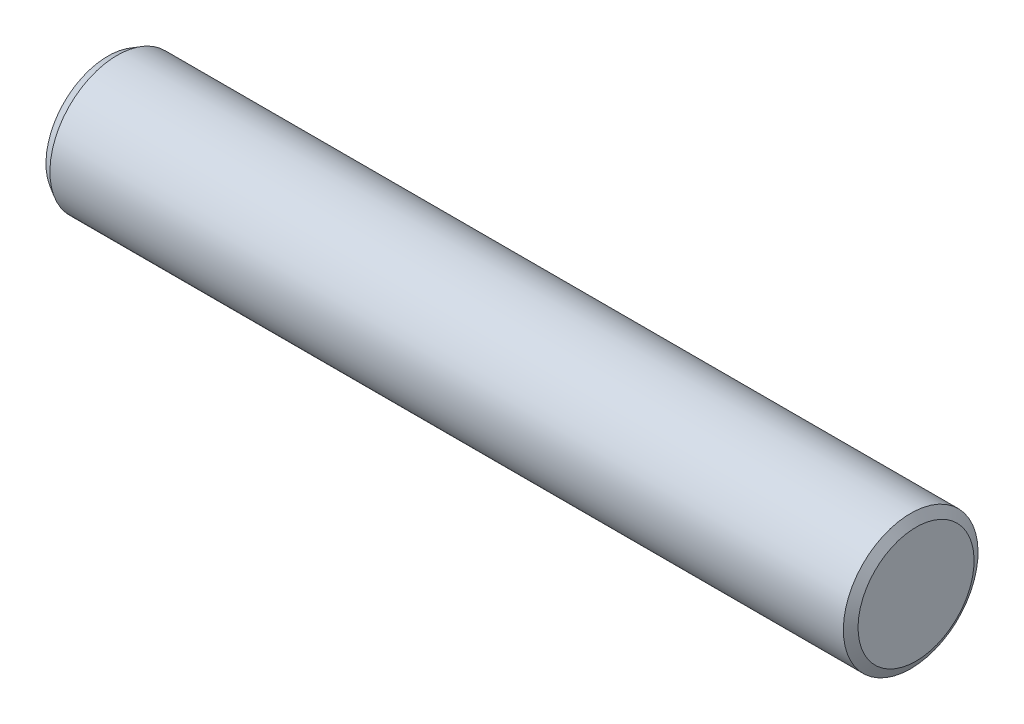
ISO-10303-21;
HEADER;
FILE_DESCRIPTION(('STEP AP214'),'2;1');
FILE_NAME('part.step','',(''),(''),'','','');
FILE_SCHEMA(('AUTOMOTIVE_DESIGN { 1 0 10303 214 1 1 1 1 }'));
ENDSEC;
DATA;
#1=APPLICATION_CONTEXT('core data for automotive mechanical design processes');
#2=APPLICATION_PROTOCOL_DEFINITION('international standard','automotive_design',2000,#1);
#3=PRODUCT_CONTEXT('',#1,'mechanical');
#4=PRODUCT('Part','Part','',(#3));
#5=PRODUCT_RELATED_PRODUCT_CATEGORY('part','',(#4));
#6=PRODUCT_DEFINITION_FORMATION('','',#4);
#7=PRODUCT_DEFINITION_CONTEXT('part definition',#1,'design');
#8=PRODUCT_DEFINITION('design','',#6,#7);
#9=PRODUCT_DEFINITION_SHAPE('','',#8);
#10=(LENGTH_UNIT() NAMED_UNIT(*) SI_UNIT(.MILLI.,.METRE.));
#11=(NAMED_UNIT(*) PLANE_ANGLE_UNIT() SI_UNIT($,.RADIAN.));
#12=(NAMED_UNIT(*) SI_UNIT($,.STERADIAN.) SOLID_ANGLE_UNIT());
#13=UNCERTAINTY_MEASURE_WITH_UNIT(LENGTH_MEASURE(1.E-05),#10,'distance_accuracy_value','');
#14=(GEOMETRIC_REPRESENTATION_CONTEXT(3) GLOBAL_UNCERTAINTY_ASSIGNED_CONTEXT((#13)) GLOBAL_UNIT_ASSIGNED_CONTEXT((#10,
#11,#12)) REPRESENTATION_CONTEXT('',''));
#15=CARTESIAN_POINT('',(0.,0.,0.));
#16=DIRECTION('',(0.,0.,1.));
#17=DIRECTION('',(1.,0.,0.));
#18=AXIS2_PLACEMENT_3D('',#15,#16,#17);
#19=CARTESIAN_POINT('',(0.,0.,0.));
#20=DIRECTION('',(1.,0.,0.));
#21=DIRECTION('',(0.,1.,0.));
#22=AXIS2_PLACEMENT_3D('',#19,#20,#21);
#23=PLANE('',#22);
#24=CARTESIAN_POINT('',(0.,0.,0.));
#25=DIRECTION('',(1.,0.,0.));
#26=DIRECTION('',(0.,1.,0.));
#27=AXIS2_PLACEMENT_3D('',#24,#25,#26);
#28=CIRCLE('',#27,2.15358983848623);
#29=CARTESIAN_POINT('',(0.,-2.15358983848623,0.));
#30=VERTEX_POINT('',#29);
#31=EDGE_CURVE('E10',#30,#30,#28,.T.);
#32=ORIENTED_EDGE('',*,*,#31,.T.);
#33=EDGE_LOOP('',(#32));
#34=FACE_BOUND('',#33,.T.);
#35=ADVANCED_FACE('F40',(#34),#23,.T.);
#36=CARTESIAN_POINT('',(0.,0.,0.));
#37=DIRECTION('',(1.,0.,0.));
#38=DIRECTION('',(0.,1.,0.));
#39=AXIS2_PLACEMENT_3D('',#36,#37,#38);
#40=CYLINDRICAL_SURFACE('',#39,2.5);
#41=CARTESIAN_POINT('',(-29.6535898384862,0.,0.));
#42=DIRECTION('',(-1.,0.,0.));
#43=DIRECTION('',(0.,-1.,0.));
#44=AXIS2_PLACEMENT_3D('',#41,#42,#43);
#45=CIRCLE('',#44,2.5);
#46=CARTESIAN_POINT('',(-29.6535898384862,-2.5,0.));
#47=VERTEX_POINT('',#46);
#48=EDGE_CURVE('E52',#47,#47,#45,.F.);
#49=ORIENTED_EDGE('',*,*,#48,.T.);
#50=EDGE_LOOP('',(#49));
#51=FACE_BOUND('',#50,.T.);
#52=CARTESIAN_POINT('',(-0.199999999999998,0.,0.));
#53=DIRECTION('',(1.,0.,0.));
#54=DIRECTION('',(0.,1.,0.));
#55=AXIS2_PLACEMENT_3D('',#52,#53,#54);
#56=CIRCLE('',#55,2.5);
#57=CARTESIAN_POINT('',(-0.199999999999997,-2.5,0.));
#58=VERTEX_POINT('',#57);
#59=EDGE_CURVE('E56',#58,#58,#56,.F.);
#60=ORIENTED_EDGE('',*,*,#59,.T.);
#61=EDGE_LOOP('',(#60));
#62=FACE_BOUND('',#61,.T.);
#63=ADVANCED_FACE('F62',(#51,#62),#40,.T.);
#64=CARTESIAN_POINT('',(-30.,0.,0.));
#65=DIRECTION('',(-1.,0.,0.));
#66=DIRECTION('',(0.,-1.,0.));
#67=AXIS2_PLACEMENT_3D('',#64,#65,#66);
#68=PLANE('',#67);
#69=CARTESIAN_POINT('',(-30.,0.,0.));
#70=DIRECTION('',(-1.,0.,0.));
#71=DIRECTION('',(0.,-1.,0.));
#72=AXIS2_PLACEMENT_3D('',#69,#70,#71);
#73=CIRCLE('',#72,2.29999999999998);
#74=CARTESIAN_POINT('',(-30.,-2.29999999999999,0.));
#75=VERTEX_POINT('',#74);
#76=EDGE_CURVE('E48',#75,#75,#73,.T.);
#77=ORIENTED_EDGE('',*,*,#76,.T.);
#78=EDGE_LOOP('',(#77));
#79=FACE_BOUND('',#78,.T.);
#80=ADVANCED_FACE('F70',(#79),#68,.T.);
#81=CARTESIAN_POINT('',(-29.6535898384862,0.,0.));
#82=DIRECTION('',(1.,0.,0.));
#83=DIRECTION('',(0.,1.,0.));
#84=AXIS2_PLACEMENT_3D('',#81,#82,#83);
#85=CONICAL_SURFACE('',#84,2.5,0.523598775598296);
#86=ORIENTED_EDGE('',*,*,#76,.F.);
#87=EDGE_LOOP('',(#86));
#88=FACE_BOUND('',#87,.T.);
#89=ORIENTED_EDGE('',*,*,#48,.F.);
#90=EDGE_LOOP('',(#89));
#91=FACE_BOUND('',#90,.T.);
#92=ADVANCED_FACE('F66',(#88,#91),#85,.T.);
#93=CARTESIAN_POINT('',(0.,0.,0.));
#94=DIRECTION('',(-1.,0.,0.));
#95=DIRECTION('',(0.,-1.,0.));
#96=AXIS2_PLACEMENT_3D('',#93,#94,#95);
#97=CONICAL_SURFACE('',#96,2.15358983848623,1.04719755119659);
#98=CARTESIAN_POINT('',(-0.199999999999997,-2.5,0.));
#99=CARTESIAN_POINT('',(-0.197916666666664,-2.49639156081756,0.));
#100=CARTESIAN_POINT('',(-0.195833333333331,-2.49278312163513,0.));
#101=CARTESIAN_POINT('',(-0.191666666666664,-2.48556624327026,0.));
#102=CARTESIAN_POINT('',(-0.189583333333331,-2.48195780408782,0.));
#103=CARTESIAN_POINT('',(-0.185416666666664,-2.47474092572295,0.));
#104=CARTESIAN_POINT('',(-0.183333333333331,-2.47113248654052,0.));
#105=CARTESIAN_POINT('',(-0.179166666666664,-2.46391560817565,0.));
#106=CARTESIAN_POINT('',(-0.177083333333331,-2.46030716899321,0.));
#107=CARTESIAN_POINT('',(-0.172916666666664,-2.45309029062834,0.));
#108=CARTESIAN_POINT('',(-0.170833333333331,-2.44948185144591,0.));
#109=CARTESIAN_POINT('',(-0.166666666666664,-2.44226497308104,0.));
#110=CARTESIAN_POINT('',(-0.164583333333331,-2.4386565338986,0.));
#111=CARTESIAN_POINT('',(-0.160416666666664,-2.43143965553373,0.));
#112=CARTESIAN_POINT('',(-0.158333333333331,-2.4278312163513,0.));
#113=CARTESIAN_POINT('',(-0.154166666666664,-2.42061433798643,0.));
#114=CARTESIAN_POINT('',(-0.152083333333331,-2.41700589880399,0.));
#115=CARTESIAN_POINT('',(-0.147916666666665,-2.40978902043912,0.));
#116=CARTESIAN_POINT('',(-0.145833333333331,-2.40618058125669,0.));
#117=CARTESIAN_POINT('',(-0.141666666666665,-2.39896370289182,0.));
#118=CARTESIAN_POINT('',(-0.139583333333331,-2.39535526370938,0.));
#119=CARTESIAN_POINT('',(-0.135416666666665,-2.38813838534451,0.));
#120=CARTESIAN_POINT('',(-0.133333333333331,-2.38452994616208,0.));
#121=CARTESIAN_POINT('',(-0.129166666666665,-2.37731306779721,0.));
#122=CARTESIAN_POINT('',(-0.127083333333331,-2.37370462861477,0.));
#123=CARTESIAN_POINT('',(-0.122916666666665,-2.3664877502499,0.));
#124=CARTESIAN_POINT('',(-0.120833333333332,-2.36287931106747,0.));
#125=CARTESIAN_POINT('',(-0.116666666666665,-2.3556624327026,0.));
#126=CARTESIAN_POINT('',(-0.114583333333332,-2.35205399352016,0.));
#127=CARTESIAN_POINT('',(-0.110416666666665,-2.34483711515529,0.));
#128=CARTESIAN_POINT('',(-0.108333333333332,-2.34122867597286,0.));
#129=CARTESIAN_POINT('',(-0.104166666666665,-2.33401179760799,0.));
#130=CARTESIAN_POINT('',(-0.102083333333332,-2.33040335842555,0.));
#131=CARTESIAN_POINT('',(-0.0979166666666651,-2.32318648006068,0.));
#132=CARTESIAN_POINT('',(-0.0958333333333318,-2.31957804087825,0.));
#133=CARTESIAN_POINT('',(-0.0916666666666652,-2.31236116251338,0.));
#134=CARTESIAN_POINT('',(-0.0895833333333319,-2.30875272333094,0.));
#135=CARTESIAN_POINT('',(-0.0854166666666653,-2.30153584496607,0.));
#136=CARTESIAN_POINT('',(-0.083333333333332,-2.29792740578364,0.));
#137=CARTESIAN_POINT('',(-0.0791666666666653,-2.29071052741876,0.));
#138=CARTESIAN_POINT('',(-0.077083333333332,-2.28710208823633,0.));
#139=CARTESIAN_POINT('',(-0.0729166666666654,-2.27988520987146,0.));
#140=CARTESIAN_POINT('',(-0.0708333333333321,-2.27627677068902,0.));
#141=CARTESIAN_POINT('',(-0.0666666666666655,-2.26905989232415,0.));
#142=CARTESIAN_POINT('',(-0.0645833333333322,-2.26545145314172,0.));
#143=CARTESIAN_POINT('',(-0.0604166666666655,-2.25823457477685,0.));
#144=CARTESIAN_POINT('',(-0.0583333333333322,-2.25462613559441,0.));
#145=CARTESIAN_POINT('',(-0.0541666666666656,-2.24740925722954,0.));
#146=CARTESIAN_POINT('',(-0.0520833333333323,-2.24380081804711,0.));
#147=CARTESIAN_POINT('',(-0.0479166666666657,-2.23658393968224,0.));
#148=CARTESIAN_POINT('',(-0.0458333333333324,-2.2329755004998,0.));
#149=CARTESIAN_POINT('',(-0.0416666666666658,-2.22575862213493,0.));
#150=CARTESIAN_POINT('',(-0.0395833333333324,-2.2221501829525,0.));
#151=CARTESIAN_POINT('',(-0.0354166666666658,-2.21493330458763,0.));
#152=CARTESIAN_POINT('',(-0.0333333333333326,-2.21132486540519,0.));
#153=CARTESIAN_POINT('',(-0.029166666666666,-2.20410798704032,0.));
#154=CARTESIAN_POINT('',(-0.0270833333333326,-2.20049954785789,0.));
#155=CARTESIAN_POINT('',(-0.022916666666666,-2.19328266949302,0.));
#156=CARTESIAN_POINT('',(-0.0208333333333327,-2.18967423031058,0.));
#157=CARTESIAN_POINT('',(-0.0166666666666661,-2.18245735194571,0.));
#158=CARTESIAN_POINT('',(-0.0145833333333328,-2.17884891276328,0.));
#159=CARTESIAN_POINT('',(-0.0104166666666661,-2.17163203439841,0.));
#160=CARTESIAN_POINT('',(-0.00833333333333283,-2.16802359521597,0.));
#161=CARTESIAN_POINT('',(-0.0041666666666662,-2.1608067168511,0.));
#162=CARTESIAN_POINT('',(-0.00208333333333289,-2.15719827766867,0.));
#163=CARTESIAN_POINT('',(0.,-2.15358983848623,0.));
#164=B_SPLINE_CURVE_WITH_KNOTS('',3,(#98,#99,#100,#101,#102,#103,#104,#105,#106,#107,#108,#109,
#110,#111,#112,#113,#114,#115,#116,#117,#118,#119,#120,#121,#122,#123,#124,#125,#126,#127,#128,
#129,#130,#131,#132,#133,#134,#135,#136,#137,#138,#139,#140,#141,#142,#143,#144,#145,#146,#147,
#148,#149,#150,#151,#152,#153,#154,#155,#156,#157,#158,#159,#160,#161,#162,#163),.UNSPECIFIED.,
.F.,.F.,(4,2,2,2,2,2,2,2,2,2,2,2,2,2,2,2,2,2,2,2,2,2,2,2,2,2,2,2,2,2,2,2,4),(0.,
0.0124999999999997,0.0249999999999994,0.0374999999999991,0.0499999999999988,0.0624999999999985,
0.0749999999999982,0.0874999999999983,0.099999999999998,0.112499999999998,0.124999999999997,
0.137499999999997,0.149999999999997,0.162499999999997,0.174999999999996,0.187499999999996,
0.199999999999996,0.212499999999996,0.224999999999995,0.237499999999995,0.249999999999995,
0.262499999999995,0.274999999999994,0.287499999999994,0.299999999999994,0.312499999999993,
0.324999999999993,0.337499999999993,0.349999999999993,0.362499999999993,0.374999999999992,
0.387499999999992,0.399999999999992),.UNSPECIFIED.);
#165=EDGE_CURVE('BSEAM43',#58,#30,#164,.T.);
#166=ORIENTED_EDGE('',*,*,#59,.F.);
#167=ORIENTED_EDGE('',*,*,#31,.F.);
#168=ORIENTED_EDGE('',*,*,#165,.T.);
#169=ORIENTED_EDGE('',*,*,#165,.F.);
#170=EDGE_LOOP('',(#166,#168,#167,#169));
#171=FACE_BOUND('',#170,.T.);
#172=ADVANCED_FACE('F43',(#171),#97,.T.);
#173=CLOSED_SHELL('',(#35,#63,#80,#92,#172));
#174=MANIFOLD_SOLID_BREP('B2',#173);
#175=ADVANCED_BREP_SHAPE_REPRESENTATION('',(#18,#174),#14);
#176=SHAPE_DEFINITION_REPRESENTATION(#9,#175);
ENDSEC;
END-ISO-10303-21;
